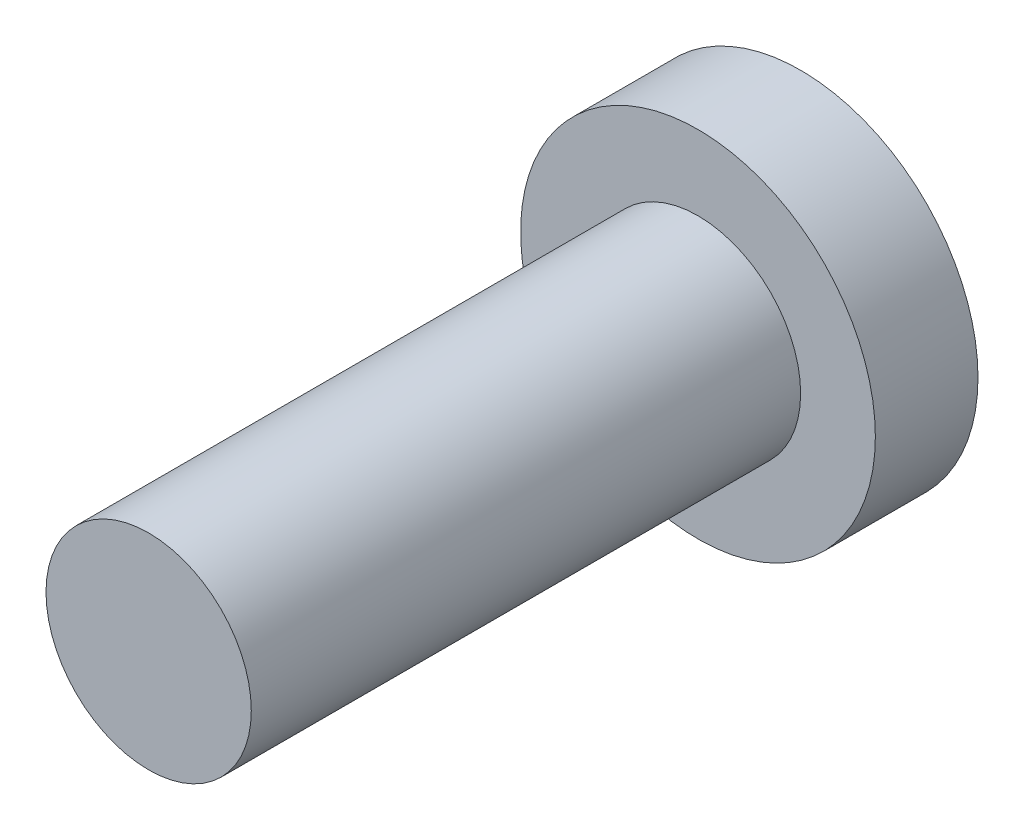
ISO-10303-21;
HEADER;
FILE_DESCRIPTION(('STEP AP214'),'2;1');
FILE_NAME('part.step','',(''),(''),'','','');
FILE_SCHEMA(('AUTOMOTIVE_DESIGN { 1 0 10303 214 1 1 1 1 }'));
ENDSEC;
DATA;
#1=APPLICATION_CONTEXT('core data for automotive mechanical design processes');
#2=APPLICATION_PROTOCOL_DEFINITION('international standard','automotive_design',2000,#1);
#3=PRODUCT_CONTEXT('',#1,'mechanical');
#4=PRODUCT('Part','Part','',(#3));
#5=PRODUCT_RELATED_PRODUCT_CATEGORY('part','',(#4));
#6=PRODUCT_DEFINITION_FORMATION('','',#4);
#7=PRODUCT_DEFINITION_CONTEXT('part definition',#1,'design');
#8=PRODUCT_DEFINITION('design','',#6,#7);
#9=PRODUCT_DEFINITION_SHAPE('','',#8);
#10=(LENGTH_UNIT() NAMED_UNIT(*) SI_UNIT(.MILLI.,.METRE.));
#11=(NAMED_UNIT(*) PLANE_ANGLE_UNIT() SI_UNIT($,.RADIAN.));
#12=(NAMED_UNIT(*) SI_UNIT($,.STERADIAN.) SOLID_ANGLE_UNIT());
#13=UNCERTAINTY_MEASURE_WITH_UNIT(LENGTH_MEASURE(1.E-05),#10,'distance_accuracy_value','');
#14=(GEOMETRIC_REPRESENTATION_CONTEXT(3) GLOBAL_UNCERTAINTY_ASSIGNED_CONTEXT((#13)) GLOBAL_UNIT_ASSIGNED_CONTEXT((#10,
#11,#12)) REPRESENTATION_CONTEXT('',''));
#15=CARTESIAN_POINT('',(0.,0.,0.));
#16=DIRECTION('',(0.,0.,1.));
#17=DIRECTION('',(1.,0.,0.));
#18=AXIS2_PLACEMENT_3D('',#15,#16,#17);
#19=CARTESIAN_POINT('',(0.,0.,2.5));
#20=DIRECTION('',(0.,0.,-1.));
#21=DIRECTION('',(-1.,0.,0.));
#22=AXIS2_PLACEMENT_3D('',#19,#20,#21);
#23=CYLINDRICAL_SURFACE('',#22,4.32);
#24=CARTESIAN_POINT('',(0.,0.,2.5));
#25=DIRECTION('',(0.,0.,1.));
#26=DIRECTION('',(1.,0.,0.));
#27=AXIS2_PLACEMENT_3D('',#24,#25,#26);
#28=CIRCLE('',#27,4.32);
#29=CARTESIAN_POINT('',(4.32,0.,2.5));
#30=VERTEX_POINT('',#29);
#31=EDGE_CURVE('E44',#30,#30,#28,.T.);
#32=ORIENTED_EDGE('',*,*,#31,.F.);
#33=EDGE_LOOP('',(#32));
#34=FACE_BOUND('',#33,.T.);
#35=CARTESIAN_POINT('',(0.,0.,0.));
#36=DIRECTION('',(0.,0.,1.));
#37=DIRECTION('',(1.,0.,0.));
#38=AXIS2_PLACEMENT_3D('',#35,#36,#37);
#39=CIRCLE('',#38,4.32);
#40=CARTESIAN_POINT('',(4.32,0.,0.));
#41=VERTEX_POINT('',#40);
#42=EDGE_CURVE('E40',#41,#41,#39,.T.);
#43=ORIENTED_EDGE('',*,*,#42,.T.);
#44=EDGE_LOOP('',(#43));
#45=FACE_BOUND('',#44,.T.);
#46=ADVANCED_FACE('F37',(#34,#45),#23,.T.);
#47=CARTESIAN_POINT('',(0.,0.,2.5));
#48=DIRECTION('',(0.,0.,1.));
#49=DIRECTION('',(1.,0.,0.));
#50=AXIS2_PLACEMENT_3D('',#47,#48,#49);
#51=PLANE('',#50);
#52=CARTESIAN_POINT('',(0.,0.,2.5));
#53=DIRECTION('',(0.,0.,1.));
#54=DIRECTION('',(1.,0.,0.));
#55=AXIS2_PLACEMENT_3D('',#52,#53,#54);
#56=CIRCLE('',#55,2.5);
#57=CARTESIAN_POINT('',(2.5,0.,2.5));
#58=VERTEX_POINT('',#57);
#59=EDGE_CURVE('E10',#58,#58,#56,.T.);
#60=ORIENTED_EDGE('',*,*,#59,.F.);
#61=EDGE_LOOP('',(#60));
#62=FACE_BOUND('',#61,.T.);
#63=ORIENTED_EDGE('',*,*,#31,.T.);
#64=EDGE_LOOP('',(#63));
#65=FACE_BOUND('',#64,.T.);
#66=ADVANCED_FACE('F61',(#62,#65),#51,.T.);
#67=CARTESIAN_POINT('',(0.,0.,0.));
#68=DIRECTION('',(0.,0.,1.));
#69=DIRECTION('',(1.,0.,0.));
#70=AXIS2_PLACEMENT_3D('',#67,#68,#69);
#71=PLANE('',#70);
#72=ORIENTED_EDGE('',*,*,#42,.F.);
#73=EDGE_LOOP('',(#72));
#74=FACE_BOUND('',#73,.T.);
#75=ADVANCED_FACE('F58',(#74),#71,.F.);
#76=CARTESIAN_POINT('',(0.,0.,15.88));
#77=DIRECTION('',(0.,0.,-1.));
#78=DIRECTION('',(-1.,0.,0.));
#79=AXIS2_PLACEMENT_3D('',#76,#77,#78);
#80=CYLINDRICAL_SURFACE('',#79,2.5);
#81=CARTESIAN_POINT('',(0.,0.,15.88));
#82=DIRECTION('',(0.,0.,1.));
#83=DIRECTION('',(1.,0.,0.));
#84=AXIS2_PLACEMENT_3D('',#81,#82,#83);
#85=CIRCLE('',#84,2.5);
#86=CARTESIAN_POINT('',(2.5,0.,15.88));
#87=VERTEX_POINT('',#86);
#88=EDGE_CURVE('E50',#87,#87,#85,.T.);
#89=ORIENTED_EDGE('',*,*,#88,.F.);
#90=EDGE_LOOP('',(#89));
#91=FACE_BOUND('',#90,.T.);
#92=ORIENTED_EDGE('',*,*,#59,.T.);
#93=EDGE_LOOP('',(#92));
#94=FACE_BOUND('',#93,.T.);
#95=ADVANCED_FACE('F60',(#91,#94),#80,.T.);
#96=CARTESIAN_POINT('',(0.,0.,15.88));
#97=DIRECTION('',(0.,0.,1.));
#98=DIRECTION('',(1.,0.,0.));
#99=AXIS2_PLACEMENT_3D('',#96,#97,#98);
#100=PLANE('',#99);
#101=ORIENTED_EDGE('',*,*,#88,.T.);
#102=EDGE_LOOP('',(#101));
#103=FACE_BOUND('',#102,.T.);
#104=ADVANCED_FACE('F67',(#103),#100,.T.);
#105=CLOSED_SHELL('',(#46,#66,#75,#95,#104));
#106=MANIFOLD_SOLID_BREP('B2',#105);
#107=ADVANCED_BREP_SHAPE_REPRESENTATION('',(#18,#106),#14);
#108=SHAPE_DEFINITION_REPRESENTATION(#9,#107);
ENDSEC;
END-ISO-10303-21;
